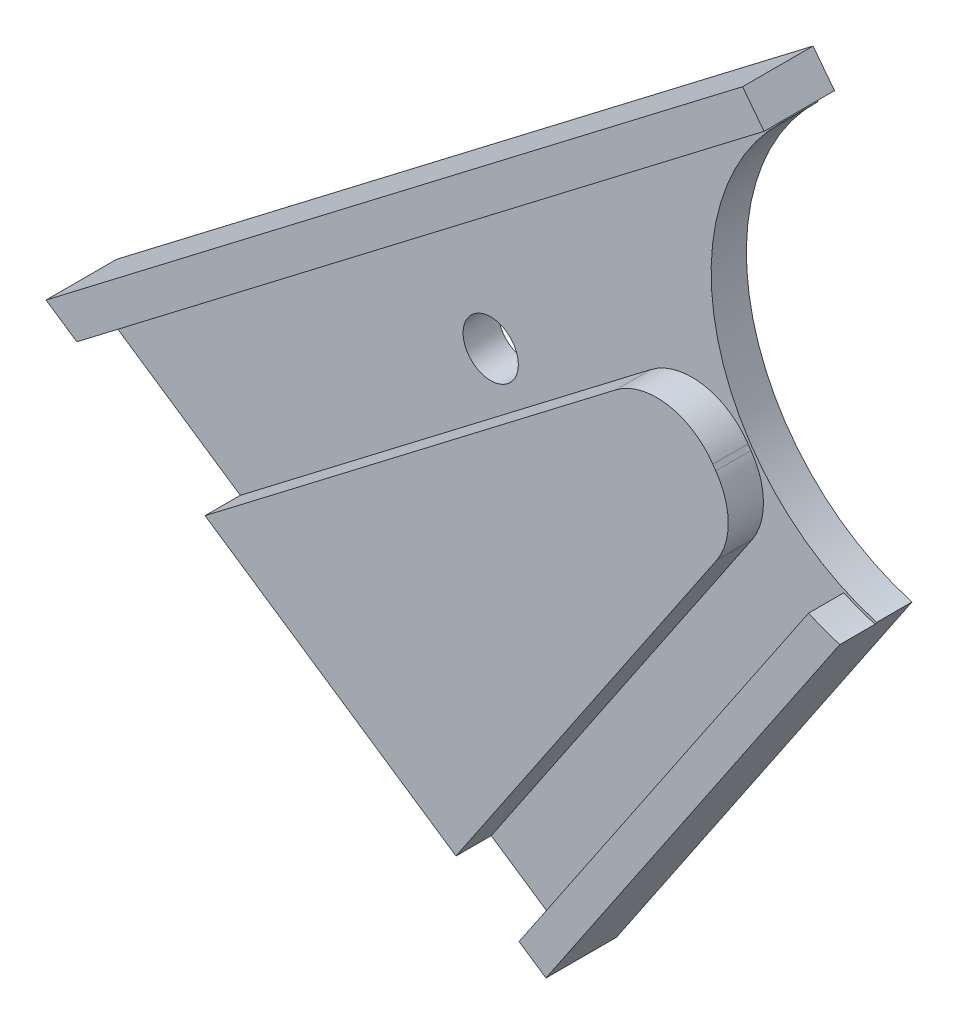
ISO-10303-21;
HEADER;
FILE_DESCRIPTION(('STEP AP214'),'2;1');
FILE_NAME('part.step','',(''),(''),'','','');
FILE_SCHEMA(('AUTOMOTIVE_DESIGN { 1 0 10303 214 1 1 1 1 }'));
ENDSEC;
DATA;
#1=APPLICATION_CONTEXT('core data for automotive mechanical design processes');
#2=APPLICATION_PROTOCOL_DEFINITION('international standard','automotive_design',2000,#1);
#3=PRODUCT_CONTEXT('',#1,'mechanical');
#4=PRODUCT('Part','Part','',(#3));
#5=PRODUCT_RELATED_PRODUCT_CATEGORY('part','',(#4));
#6=PRODUCT_DEFINITION_FORMATION('','',#4);
#7=PRODUCT_DEFINITION_CONTEXT('part definition',#1,'design');
#8=PRODUCT_DEFINITION('design','',#6,#7);
#9=PRODUCT_DEFINITION_SHAPE('','',#8);
#10=(LENGTH_UNIT() NAMED_UNIT(*) SI_UNIT(.MILLI.,.METRE.));
#11=(NAMED_UNIT(*) PLANE_ANGLE_UNIT() SI_UNIT($,.RADIAN.));
#12=(NAMED_UNIT(*) SI_UNIT($,.STERADIAN.) SOLID_ANGLE_UNIT());
#13=UNCERTAINTY_MEASURE_WITH_UNIT(LENGTH_MEASURE(1.E-05),#10,'distance_accuracy_value','');
#14=(GEOMETRIC_REPRESENTATION_CONTEXT(3) GLOBAL_UNCERTAINTY_ASSIGNED_CONTEXT((#13)) GLOBAL_UNIT_ASSIGNED_CONTEXT((#10,
#11,#12)) REPRESENTATION_CONTEXT('',''));
#15=CARTESIAN_POINT('',(0.,0.,0.));
#16=DIRECTION('',(0.,0.,1.));
#17=DIRECTION('',(1.,0.,0.));
#18=AXIS2_PLACEMENT_3D('',#15,#16,#17);
#19=CARTESIAN_POINT('',(0.,0.,3.175));
#20=DIRECTION('',(0.,0.,1.));
#21=DIRECTION('',(1.,0.,0.));
#22=AXIS2_PLACEMENT_3D('',#19,#20,#21);
#23=PLANE('',#22);
#24=CARTESIAN_POINT('',(504.511571135266,517.150066419649,3.175));
#25=DIRECTION('',(0.,0.,1.));
#26=DIRECTION('',(1.,0.,0.));
#27=AXIS2_PLACEMENT_3D('',#24,#25,#26);
#28=CIRCLE('',#27,20.8915);
#29=CARTESIAN_POINT('',(498.646303140477,497.09879704339,3.175));
#30=VERTEX_POINT('',#29);
#31=CARTESIAN_POINT('',(495.830397733204,498.147645505109,3.175));
#32=VERTEX_POINT('',#31);
#33=EDGE_CURVE('E259',#30,#32,#28,.F.);
#34=ORIENTED_EDGE('',*,*,#33,.F.);
#35=DIRECTION('',(0.559192903470747,0.829037572555041,0.));
#36=VECTOR('',#35,1.);
#37=CARTESIAN_POINT('',(112.270258668083,-75.7272456597241,3.175));
#38=LINE('',#37,#36);
#39=CARTESIAN_POINT('',(498.795485399412,497.319968837681,3.175));
#40=VERTEX_POINT('',#39);
#41=EDGE_CURVE('E391',#30,#40,#38,.T.);
#42=ORIENTED_EDGE('',*,*,#41,.T.);
#43=CARTESIAN_POINT('',(504.511571135266,517.150066419649,3.175));
#44=DIRECTION('',(0.,0.,1.));
#45=DIRECTION('',(1.,0.,0.));
#46=AXIS2_PLACEMENT_3D('',#43,#44,#45);
#47=CIRCLE('',#46,20.6375);
#48=CARTESIAN_POINT('',(490.316044259021,532.129833539194,3.175));
#49=VERTEX_POINT('',#48);
#50=EDGE_CURVE('E395',#49,#40,#47,.T.);
#51=ORIENTED_EDGE('',*,*,#50,.F.);
#52=DIRECTION('',(0.687851090308898,-0.725851828929886,0.));
#53=VECTOR('',#52,1.);
#54=CARTESIAN_POINT('',(524.009045454508,496.575442647848,3.175));
#55=LINE('',#54,#53);
#56=CARTESIAN_POINT('',(490.141330082083,532.314199903743,3.175));
#57=VERTEX_POINT('',#56);
#58=EDGE_CURVE('E399',#57,#49,#55,.T.);
#59=ORIENTED_EDGE('',*,*,#58,.F.);
#60=CARTESIAN_POINT('',(504.511571135266,517.150066419649,3.175));
#61=DIRECTION('',(0.,0.,1.));
#62=DIRECTION('',(1.,0.,0.));
#63=AXIS2_PLACEMENT_3D('',#60,#61,#62);
#64=CIRCLE('',#63,20.8915);
#65=CARTESIAN_POINT('',(491.815309265469,533.741018977702,3.175));
#66=VERTEX_POINT('',#65);
#67=EDGE_CURVE('E403',#66,#57,#64,.T.);
#68=ORIENTED_EDGE('',*,*,#67,.F.);
#69=DIRECTION('',(0.794148460285417,0.607723804886975,0.));
#70=VECTOR('',#69,1.);
#71=CARTESIAN_POINT('',(-75.954376972135,99.2540542912867,3.175));
#72=LINE('',#71,#70);
#73=CARTESIAN_POINT('',(429.889049813533,486.351816708112,3.175));
#74=VERTEX_POINT('',#73);
#75=EDGE_CURVE('E318',#74,#66,#72,.T.);
#76=ORIENTED_EDGE('',*,*,#75,.F.);
#77=DIRECTION('',(-0.829037572555041,0.559192903470747,0.));
#78=VECTOR('',#77,1.);
#79=CARTESIAN_POINT('',(359.893664703535,533.564300104471,3.175));
#80=LINE('',#79,#78);
#81=CARTESIAN_POINT('',(441.440727472043,478.560111743629,3.175));
#82=VERTEX_POINT('',#81);
#83=EDGE_CURVE('E392',#82,#74,#80,.T.);
#84=ORIENTED_EDGE('',*,*,#83,.F.);
#85=DIRECTION('',(0.794148460285417,0.607723804886974,0.));
#86=VECTOR('',#85,1.);
#87=CARTESIAN_POINT('',(-67.9275609571879,88.7649414278371,3.175));
#88=LINE('',#87,#86);
#89=CARTESIAN_POINT('',(478.447155565869,506.879359857985,3.175));
#90=VERTEX_POINT('',#89);
#91=EDGE_CURVE('E377',#82,#90,#88,.T.);
#92=ORIENTED_EDGE('',*,*,#91,.T.);
#93=CARTESIAN_POINT('',(482.15183988046,502.038230844085,3.175));
#94=DIRECTION('',(0.,0.,1.));
#95=DIRECTION('',(1.,0.,0.));
#96=AXIS2_PLACEMENT_3D('',#93,#94,#95);
#97=CIRCLE('',#96,6.09599999999997);
#98=CARTESIAN_POINT('',(487.202508587428,505.451727821154,3.175));
#99=VERTEX_POINT('',#98);
#100=EDGE_CURVE('E380',#99,#90,#97,.T.);
#101=ORIENTED_EDGE('',*,*,#100,.F.);
#102=CARTESIAN_POINT('',(504.511571135266,517.150066419649,3.175));
#103=DIRECTION('',(0.,0.,1.));
#104=DIRECTION('',(1.,0.,0.));
#105=AXIS2_PLACEMENT_3D('',#102,#103,#104);
#106=CIRCLE('',#105,20.8915);
#107=CARTESIAN_POINT('',(487.468121912979,505.068029718109,3.175));
#108=VERTEX_POINT('',#107);
#109=EDGE_CURVE('E384',#108,#99,#106,.F.);
#110=ORIENTED_EDGE('',*,*,#109,.F.);
#111=CARTESIAN_POINT('',(482.49495739827,501.542572200335,3.175));
#112=DIRECTION('',(0.,0.,1.));
#113=DIRECTION('',(1.,0.,0.));
#114=AXIS2_PLACEMENT_3D('',#111,#112,#113);
#115=CIRCLE('',#114,6.09600000000011);
#116=CARTESIAN_POINT('',(487.548770440565,498.133732260777,3.175));
#117=VERTEX_POINT('',#116);
#118=EDGE_CURVE('E369',#117,#108,#115,.T.);
#119=ORIENTED_EDGE('',*,*,#118,.F.);
#120=DIRECTION('',(0.559192903470747,0.829037572555042,0.));
#121=VECTOR('',#120,1.);
#122=CARTESIAN_POINT('',(104.163100246067,-70.2588982566839,3.175));
#123=LINE('',#122,#121);
#124=CARTESIAN_POINT('',(464.056764949602,463.305401847788,3.175));
#125=VERTEX_POINT('',#124);
#126=EDGE_CURVE('E373',#125,#117,#123,.T.);
#127=ORIENTED_EDGE('',*,*,#126,.F.);
#128=CARTESIAN_POINT('',(469.742304622184,459.470456915785,3.175));
#129=VERTEX_POINT('',#128);
#130=EDGE_CURVE('E152',#129,#125,#80,.T.);
#131=ORIENTED_EDGE('',*,*,#130,.F.);
#132=DIRECTION('',(0.559192903470747,0.829037572555042,0.));
#133=VECTOR('',#132,1.);
#134=CARTESIAN_POINT('',(109.84863991865,-74.0938431886862,3.175));
#135=LINE('',#134,#133);
#136=EDGE_CURVE('E147',#129,#32,#135,.T.);
#137=ORIENTED_EDGE('',*,*,#136,.T.);
#138=EDGE_LOOP('',(#34,#42,#51,#59,#68,#76,#84,#92,#101,#110,#119,#127,#131,#137));
#139=FACE_BOUND('',#138,.T.);
#140=CARTESIAN_POINT('',(464.009536590087,501.284203587237,3.175));
#141=DIRECTION('',(0.,0.,1.));
#142=DIRECTION('',(1.,0.,0.));
#143=AXIS2_PLACEMENT_3D('',#140,#141,#142);
#144=CIRCLE('',#143,2.48919999999983);
#145=CARTESIAN_POINT('',(466.498736590087,501.284203587237,3.175));
#146=VERTEX_POINT('',#145);
#147=EDGE_CURVE('E407',#146,#146,#144,.T.);
#148=ORIENTED_EDGE('',*,*,#147,.F.);
#149=EDGE_LOOP('',(#148));
#150=FACE_BOUND('',#149,.T.);
#151=ADVANCED_FACE('F131',(#139,#150),#23,.T.);
#152=CARTESIAN_POINT('',(-77.8839000526511,101.775475652693,3.175));
#153=DIRECTION('',(0.607723804886975,-0.794148460285417,0.));
#154=DIRECTION('',(0.794148460285417,0.607723804886975,0.));
#155=AXIS2_PLACEMENT_3D('',#152,#153,#154);
#156=PLANE('',#155);
#157=DIRECTION('',(-0.794148460285417,-0.607723804886975,0.));
#158=VECTOR('',#157,1.);
#159=CARTESIAN_POINT('',(-77.8839000526511,101.775475652693,0.));
#160=LINE('',#159,#158);
#161=CARTESIAN_POINT('',(489.885786184953,536.262440339108,0.));
#162=VERTEX_POINT('',#161);
#163=CARTESIAN_POINT('',(427.112204222545,488.22482270919,0.));
#164=VERTEX_POINT('',#163);
#165=EDGE_CURVE('E388',#162,#164,#160,.T.);
#166=ORIENTED_EDGE('',*,*,#165,.T.);
#167=DIRECTION('',(0.,0.,-1.));
#168=VECTOR('',#167,1.);
#169=CARTESIAN_POINT('',(427.112204222545,488.22482270919,3.175));
#170=LINE('',#169,#168);
#171=CARTESIAN_POINT('',(427.112204222545,488.22482270919,6.35));
#172=VERTEX_POINT('',#171);
#173=EDGE_CURVE('E12',#172,#164,#170,.T.);
#174=ORIENTED_EDGE('',*,*,#173,.F.);
#175=DIRECTION('',(-0.794148460285417,-0.607723804886975,0.));
#176=VECTOR('',#175,1.);
#177=CARTESIAN_POINT('',(-77.8839000526511,101.775475652693,6.35));
#178=LINE('',#177,#176);
#179=CARTESIAN_POINT('',(489.885786184953,536.262440339108,6.35));
#180=VERTEX_POINT('',#179);
#181=EDGE_CURVE('E298',#180,#172,#178,.T.);
#182=ORIENTED_EDGE('',*,*,#181,.F.);
#183=DIRECTION('',(0.,0.,-1.));
#184=VECTOR('',#183,1.);
#185=CARTESIAN_POINT('',(489.885786184953,536.262440339108,3.175));
#186=LINE('',#185,#184);
#187=EDGE_CURVE('E411',#180,#162,#186,.T.);
#188=ORIENTED_EDGE('',*,*,#187,.T.);
#189=EDGE_LOOP('',(#166,#174,#182,#188));
#190=FACE_BOUND('',#189,.T.);
#191=ADVANCED_FACE('F133',(#190),#156,.F.);
#192=CARTESIAN_POINT('',(359.893664703535,533.564300104471,3.175));
#193=DIRECTION('',(-0.559192903470747,-0.829037572555041,0.));
#194=DIRECTION('',(0.829037572555041,-0.559192903470747,0.));
#195=AXIS2_PLACEMENT_3D('',#192,#193,#194);
#196=PLANE('',#195);
#197=DIRECTION('',(0.,0.,-1.));
#198=VECTOR('',#197,1.);
#199=CARTESIAN_POINT('',(472.163923371617,457.837054444747,3.175));
#200=LINE('',#199,#198);
#201=CARTESIAN_POINT('',(472.163923371617,457.837054444747,6.35));
#202=VERTEX_POINT('',#201);
#203=CARTESIAN_POINT('',(472.163923371617,457.837054444747,0.));
#204=VERTEX_POINT('',#203);
#205=EDGE_CURVE('E140',#202,#204,#200,.T.);
#206=ORIENTED_EDGE('',*,*,#205,.F.);
#207=DIRECTION('',(-0.829037572555041,0.559192903470747,0.));
#208=VECTOR('',#207,1.);
#209=CARTESIAN_POINT('',(359.893664703535,533.564300104471,6.35));
#210=LINE('',#209,#208);
#211=CARTESIAN_POINT('',(469.742304622184,459.470456915785,6.35));
#212=VERTEX_POINT('',#211);
#213=EDGE_CURVE('E272',#202,#212,#210,.T.);
#214=ORIENTED_EDGE('',*,*,#213,.T.);
#215=DIRECTION('',(0.,0.,-1.));
#216=VECTOR('',#215,1.);
#217=CARTESIAN_POINT('',(469.742304622184,459.470456915785,6.35));
#218=LINE('',#217,#216);
#219=EDGE_CURVE('E262',#212,#129,#218,.T.);
#220=ORIENTED_EDGE('',*,*,#219,.T.);
#221=ORIENTED_EDGE('',*,*,#130,.T.);
#222=DIRECTION('',(0.,0.,-1.));
#223=VECTOR('',#222,1.);
#224=CARTESIAN_POINT('',(464.056764949602,463.305401847788,6.35));
#225=LINE('',#224,#223);
#226=CARTESIAN_POINT('',(464.056764949602,463.305401847788,6.35));
#227=VERTEX_POINT('',#226);
#228=EDGE_CURVE('E353',#227,#125,#225,.T.);
#229=ORIENTED_EDGE('',*,*,#228,.F.);
#230=DIRECTION('',(-0.829037572555041,0.559192903470747,0.));
#231=VECTOR('',#230,1.);
#232=CARTESIAN_POINT('',(359.893664703535,533.564300104471,6.35));
#233=LINE('',#232,#231);
#234=CARTESIAN_POINT('',(441.440727472043,478.560111743629,6.35));
#235=VERTEX_POINT('',#234);
#236=EDGE_CURVE('E333',#227,#235,#233,.T.);
#237=ORIENTED_EDGE('',*,*,#236,.T.);
#238=DIRECTION('',(0.,0.,-1.));
#239=VECTOR('',#238,1.);
#240=CARTESIAN_POINT('',(441.440727472043,478.560111743629,6.35));
#241=LINE('',#240,#239);
#242=EDGE_CURVE('E357',#235,#82,#241,.T.);
#243=ORIENTED_EDGE('',*,*,#242,.T.);
#244=ORIENTED_EDGE('',*,*,#83,.T.);
#245=DIRECTION('',(0.,0.,-1.));
#246=VECTOR('',#245,1.);
#247=CARTESIAN_POINT('',(429.889049813533,486.351816708112,6.35));
#248=LINE('',#247,#246);
#249=CARTESIAN_POINT('',(429.889049813533,486.351816708112,6.35));
#250=VERTEX_POINT('',#249);
#251=EDGE_CURVE('E314',#250,#74,#248,.T.);
#252=ORIENTED_EDGE('',*,*,#251,.F.);
#253=DIRECTION('',(-0.829037572555041,0.559192903470747,0.));
#254=VECTOR('',#253,1.);
#255=CARTESIAN_POINT('',(359.893664703535,533.564300104471,6.35));
#256=LINE('',#255,#254);
#257=EDGE_CURVE('E302',#250,#172,#256,.T.);
#258=ORIENTED_EDGE('',*,*,#257,.T.);
#259=ORIENTED_EDGE('',*,*,#173,.T.);
#260=DIRECTION('',(-0.829037572555041,0.559192903470747,0.));
#261=VECTOR('',#260,1.);
#262=CARTESIAN_POINT('',(359.893664703535,533.564300104471,0.));
#263=LINE('',#262,#261);
#264=EDGE_CURVE('E415',#204,#164,#263,.T.);
#265=ORIENTED_EDGE('',*,*,#264,.F.);
#266=EDGE_LOOP('',(#206,#214,#220,#221,#229,#237,#243,#244,#252,#258,#259,#265));
#267=FACE_BOUND('',#266,.T.);
#268=ADVANCED_FACE('F467',(#267),#196,.T.);
#269=CARTESIAN_POINT('',(112.270258668083,-75.7272456597241,3.175));
#270=DIRECTION('',(-0.829037572555041,0.559192903470747,0.));
#271=DIRECTION('',(-0.559192903470747,-0.829037572555041,0.));
#272=AXIS2_PLACEMENT_3D('',#269,#270,#271);
#273=PLANE('',#272);
#274=ORIENTED_EDGE('',*,*,#41,.F.);
#275=DIRECTION('',(0.,0.,-1.));
#276=VECTOR('',#275,1.);
#277=CARTESIAN_POINT('',(498.646303140477,497.09879704339,6.35));
#278=LINE('',#277,#276);
#279=CARTESIAN_POINT('',(498.646303140477,497.09879704339,6.35));
#280=VERTEX_POINT('',#279);
#281=EDGE_CURVE('E285',#280,#30,#278,.T.);
#282=ORIENTED_EDGE('',*,*,#281,.F.);
#283=DIRECTION('',(0.559192903470747,0.829037572555041,0.));
#284=VECTOR('',#283,1.);
#285=CARTESIAN_POINT('',(112.270258668083,-75.7272456597241,6.35));
#286=LINE('',#285,#284);
#287=EDGE_CURVE('E276',#202,#280,#286,.T.);
#288=ORIENTED_EDGE('',*,*,#287,.F.);
#289=ORIENTED_EDGE('',*,*,#205,.T.);
#290=DIRECTION('',(0.559192903470747,0.829037572555041,0.));
#291=VECTOR('',#290,1.);
#292=CARTESIAN_POINT('',(112.270258668083,-75.7272456597241,0.));
#293=LINE('',#292,#291);
#294=CARTESIAN_POINT('',(498.795485399412,497.319968837681,0.));
#295=VERTEX_POINT('',#294);
#296=EDGE_CURVE('E418',#204,#295,#293,.T.);
#297=ORIENTED_EDGE('',*,*,#296,.T.);
#298=DIRECTION('',(0.,0.,-1.));
#299=VECTOR('',#298,1.);
#300=CARTESIAN_POINT('',(498.795485399412,497.319968837681,3.175));
#301=LINE('',#300,#299);
#302=EDGE_CURVE('E452',#40,#295,#301,.T.);
#303=ORIENTED_EDGE('',*,*,#302,.F.);
#304=EDGE_LOOP('',(#274,#282,#288,#289,#297,#303));
#305=FACE_BOUND('',#304,.T.);
#306=ADVANCED_FACE('F458',(#305),#273,.F.);
#307=CARTESIAN_POINT('',(504.511571135266,517.150066419649,3.175));
#308=DIRECTION('',(0.,0.,-1.));
#309=DIRECTION('',(-1.,0.,0.));
#310=AXIS2_PLACEMENT_3D('',#307,#308,#309);
#311=CYLINDRICAL_SURFACE('',#310,20.6375);
#312=CARTESIAN_POINT('',(504.511571135266,517.150066419649,0.));
#313=DIRECTION('',(0.,0.,1.));
#314=DIRECTION('',(1.,0.,0.));
#315=AXIS2_PLACEMENT_3D('',#312,#313,#314);
#316=CIRCLE('',#315,20.6375);
#317=CARTESIAN_POINT('',(490.316044259021,532.129833539194,0.));
#318=VERTEX_POINT('',#317);
#319=EDGE_CURVE('E421',#318,#295,#316,.T.);
#320=ORIENTED_EDGE('',*,*,#319,.F.);
#321=DIRECTION('',(0.,0.,-1.));
#322=VECTOR('',#321,1.);
#323=CARTESIAN_POINT('',(490.316044259021,532.129833539194,3.175));
#324=LINE('',#323,#322);
#325=EDGE_CURVE('E449',#49,#318,#324,.T.);
#326=ORIENTED_EDGE('',*,*,#325,.F.);
#327=ORIENTED_EDGE('',*,*,#50,.T.);
#328=ORIENTED_EDGE('',*,*,#302,.T.);
#329=EDGE_LOOP('',(#320,#326,#327,#328));
#330=FACE_BOUND('',#329,.T.);
#331=ADVANCED_FACE('F484',(#330),#311,.F.);
#332=CARTESIAN_POINT('',(524.009045454508,496.575442647848,3.175));
#333=DIRECTION('',(0.725851828929886,0.687851090308898,0.));
#334=DIRECTION('',(-0.687851090308898,0.725851828929886,0.));
#335=AXIS2_PLACEMENT_3D('',#332,#333,#334);
#336=PLANE('',#335);
#337=DIRECTION('',(0.687851090308898,-0.725851828929886,0.));
#338=VECTOR('',#337,1.);
#339=CARTESIAN_POINT('',(524.009045454508,496.575442647848,0.));
#340=LINE('',#339,#338);
#341=CARTESIAN_POINT('',(490.141330082083,532.314199903743,0.));
#342=VERTEX_POINT('',#341);
#343=EDGE_CURVE('E425',#342,#318,#340,.T.);
#344=ORIENTED_EDGE('',*,*,#343,.F.);
#345=DIRECTION('',(0.,0.,-1.));
#346=VECTOR('',#345,1.);
#347=CARTESIAN_POINT('',(490.141330082083,532.314199903743,3.175));
#348=LINE('',#347,#346);
#349=EDGE_CURVE('E446',#57,#342,#348,.T.);
#350=ORIENTED_EDGE('',*,*,#349,.F.);
#351=ORIENTED_EDGE('',*,*,#58,.T.);
#352=ORIENTED_EDGE('',*,*,#325,.T.);
#353=EDGE_LOOP('',(#344,#350,#351,#352));
#354=FACE_BOUND('',#353,.T.);
#355=ADVANCED_FACE('F480',(#354),#336,.T.);
#356=CARTESIAN_POINT('',(504.511571135266,517.150066419649,3.175));
#357=DIRECTION('',(0.,0.,-1.));
#358=DIRECTION('',(-1.,0.,0.));
#359=AXIS2_PLACEMENT_3D('',#356,#357,#358);
#360=CYLINDRICAL_SURFACE('',#359,20.8915);
#361=CARTESIAN_POINT('',(504.511571135266,517.150066419649,0.));
#362=DIRECTION('',(0.,0.,1.));
#363=DIRECTION('',(1.,0.,0.));
#364=AXIS2_PLACEMENT_3D('',#361,#362,#363);
#365=CIRCLE('',#364,20.8915);
#366=CARTESIAN_POINT('',(491.815309265469,533.741018977702,0.));
#367=VERTEX_POINT('',#366);
#368=EDGE_CURVE('E429',#367,#342,#365,.T.);
#369=ORIENTED_EDGE('',*,*,#368,.F.);
#370=DIRECTION('',(0.,0.,-1.));
#371=VECTOR('',#370,1.);
#372=CARTESIAN_POINT('',(491.815309265469,533.741018977702,3.175));
#373=LINE('',#372,#371);
#374=EDGE_CURVE('E443',#66,#367,#373,.T.);
#375=ORIENTED_EDGE('',*,*,#374,.F.);
#376=ORIENTED_EDGE('',*,*,#67,.T.);
#377=ORIENTED_EDGE('',*,*,#349,.T.);
#378=EDGE_LOOP('',(#369,#375,#376,#377));
#379=FACE_BOUND('',#378,.T.);
#380=ADVANCED_FACE('F477',(#379),#360,.F.);
#381=CARTESIAN_POINT('',(567.769686237607,434.48696468641,3.175));
#382=DIRECTION('',(0.794148460285422,0.607723804886968,0.));
#383=DIRECTION('',(-0.607723804886968,0.794148460285422,0.));
#384=AXIS2_PLACEMENT_3D('',#381,#382,#383);
#385=PLANE('',#384);
#386=DIRECTION('',(0.607723804886968,-0.794148460285422,0.));
#387=VECTOR('',#386,1.);
#388=CARTESIAN_POINT('',(567.769686237607,434.48696468641,0.));
#389=LINE('',#388,#387);
#390=EDGE_CURVE('E433',#162,#367,#389,.T.);
#391=ORIENTED_EDGE('',*,*,#390,.F.);
#392=ORIENTED_EDGE('',*,*,#187,.F.);
#393=DIRECTION('',(0.607723804886968,-0.794148460285422,0.));
#394=VECTOR('',#393,1.);
#395=CARTESIAN_POINT('',(567.769686237607,434.48696468641,6.35));
#396=LINE('',#395,#394);
#397=CARTESIAN_POINT('',(491.815309265469,533.741018977702,6.35));
#398=VERTEX_POINT('',#397);
#399=EDGE_CURVE('E294',#180,#398,#396,.T.);
#400=ORIENTED_EDGE('',*,*,#399,.T.);
#401=DIRECTION('',(0.,0.,-1.));
#402=VECTOR('',#401,1.);
#403=CARTESIAN_POINT('',(491.815309265469,533.741018977702,6.35));
#404=LINE('',#403,#402);
#405=EDGE_CURVE('E310',#398,#66,#404,.T.);
#406=ORIENTED_EDGE('',*,*,#405,.T.);
#407=ORIENTED_EDGE('',*,*,#374,.T.);
#408=EDGE_LOOP('',(#391,#392,#400,#406,#407));
#409=FACE_BOUND('',#408,.T.);
#410=ADVANCED_FACE('F473',(#409),#385,.T.);
#411=CARTESIAN_POINT('',(464.009536590087,501.284203587237,3.175));
#412=DIRECTION('',(0.,0.,-1.));
#413=DIRECTION('',(-1.,0.,0.));
#414=AXIS2_PLACEMENT_3D('',#411,#412,#413);
#415=CYLINDRICAL_SURFACE('',#414,2.48919999999983);
#416=ORIENTED_EDGE('',*,*,#147,.T.);
#417=EDGE_LOOP('',(#416));
#418=FACE_BOUND('',#417,.T.);
#419=CARTESIAN_POINT('',(464.009536590087,501.284203587237,0.));
#420=DIRECTION('',(0.,0.,1.));
#421=DIRECTION('',(1.,0.,0.));
#422=AXIS2_PLACEMENT_3D('',#419,#420,#421);
#423=CIRCLE('',#422,2.48919999999983);
#424=CARTESIAN_POINT('',(466.498736590087,501.284203587237,0.));
#425=VERTEX_POINT('',#424);
#426=EDGE_CURVE('E437',#425,#425,#423,.T.);
#427=ORIENTED_EDGE('',*,*,#426,.F.);
#428=EDGE_LOOP('',(#427));
#429=FACE_BOUND('',#428,.T.);
#430=ADVANCED_FACE('F490',(#418,#429),#415,.F.);
#431=CARTESIAN_POINT('',(0.,0.,0.));
#432=DIRECTION('',(0.,0.,1.));
#433=DIRECTION('',(1.,0.,0.));
#434=AXIS2_PLACEMENT_3D('',#431,#432,#433);
#435=PLANE('',#434);
#436=ORIENTED_EDGE('',*,*,#319,.T.);
#437=ORIENTED_EDGE('',*,*,#296,.F.);
#438=ORIENTED_EDGE('',*,*,#264,.T.);
#439=ORIENTED_EDGE('',*,*,#165,.F.);
#440=ORIENTED_EDGE('',*,*,#390,.T.);
#441=ORIENTED_EDGE('',*,*,#368,.T.);
#442=ORIENTED_EDGE('',*,*,#343,.T.);
#443=EDGE_LOOP('',(#436,#437,#438,#439,#440,#441,#442));
#444=FACE_BOUND('',#443,.T.);
#445=ORIENTED_EDGE('',*,*,#426,.T.);
#446=EDGE_LOOP('',(#445));
#447=FACE_BOUND('',#446,.T.);
#448=ADVANCED_FACE('F463',(#444,#447),#435,.F.);
#449=CARTESIAN_POINT('',(504.511571135266,517.150066419649,6.35));
#450=DIRECTION('',(0.,0.,-1.));
#451=DIRECTION('',(-1.,0.,0.));
#452=AXIS2_PLACEMENT_3D('',#449,#450,#451);
#453=CYLINDRICAL_SURFACE('',#452,20.8915);
#454=DIRECTION('',(0.,0.,-1.));
#455=VECTOR('',#454,1.);
#456=CARTESIAN_POINT('',(487.468121912979,505.068029718109,6.35));
#457=LINE('',#456,#455);
#458=CARTESIAN_POINT('',(487.468121912979,505.068029718109,6.35));
#459=VERTEX_POINT('',#458);
#460=EDGE_CURVE('E345',#459,#108,#457,.T.);
#461=ORIENTED_EDGE('',*,*,#460,.T.);
#462=ORIENTED_EDGE('',*,*,#109,.T.);
#463=DIRECTION('',(0.,0.,-1.));
#464=VECTOR('',#463,1.);
#465=CARTESIAN_POINT('',(487.202508587428,505.451727821154,6.35));
#466=LINE('',#465,#464);
#467=CARTESIAN_POINT('',(487.202508587428,505.451727821154,6.35));
#468=VERTEX_POINT('',#467);
#469=EDGE_CURVE('E365',#468,#99,#466,.T.);
#470=ORIENTED_EDGE('',*,*,#469,.F.);
#471=CARTESIAN_POINT('',(504.511571135266,517.150066419649,6.35));
#472=DIRECTION('',(0.,0.,1.));
#473=DIRECTION('',(1.,0.,0.));
#474=AXIS2_PLACEMENT_3D('',#471,#472,#473);
#475=CIRCLE('',#474,20.8915);
#476=EDGE_CURVE('E322',#468,#459,#475,.T.);
#477=ORIENTED_EDGE('',*,*,#476,.T.);
#478=EDGE_LOOP('',(#461,#462,#470,#477));
#479=FACE_BOUND('',#478,.T.);
#480=ADVANCED_FACE('F496',(#479),#453,.F.);
#481=CARTESIAN_POINT('',(482.15183988046,502.038230844085,6.35));
#482=DIRECTION('',(0.,0.,-1.));
#483=DIRECTION('',(-1.,0.,0.));
#484=AXIS2_PLACEMENT_3D('',#481,#482,#483);
#485=CYLINDRICAL_SURFACE('',#484,6.09599999999997);
#486=ORIENTED_EDGE('',*,*,#469,.T.);
#487=ORIENTED_EDGE('',*,*,#100,.T.);
#488=DIRECTION('',(0.,0.,-1.));
#489=VECTOR('',#488,1.);
#490=CARTESIAN_POINT('',(478.447155565869,506.879359857985,6.35));
#491=LINE('',#490,#489);
#492=CARTESIAN_POINT('',(478.447155565869,506.879359857985,6.35));
#493=VERTEX_POINT('',#492);
#494=EDGE_CURVE('E361',#493,#90,#491,.T.);
#495=ORIENTED_EDGE('',*,*,#494,.F.);
#496=CARTESIAN_POINT('',(482.15183988046,502.038230844085,6.35));
#497=DIRECTION('',(0.,0.,1.));
#498=DIRECTION('',(1.,0.,0.));
#499=AXIS2_PLACEMENT_3D('',#496,#497,#498);
#500=CIRCLE('',#499,6.09599999999997);
#501=EDGE_CURVE('E326',#493,#468,#500,.F.);
#502=ORIENTED_EDGE('',*,*,#501,.T.);
#503=EDGE_LOOP('',(#486,#487,#495,#502));
#504=FACE_BOUND('',#503,.T.);
#505=ADVANCED_FACE('F502',(#504),#485,.T.);
#506=CARTESIAN_POINT('',(-67.9275609571879,88.7649414278371,6.35));
#507=DIRECTION('',(0.607723804886974,-0.794148460285417,0.));
#508=DIRECTION('',(0.794148460285417,0.607723804886974,0.));
#509=AXIS2_PLACEMENT_3D('',#506,#507,#508);
#510=PLANE('',#509);
#511=ORIENTED_EDGE('',*,*,#91,.F.);
#512=ORIENTED_EDGE('',*,*,#242,.F.);
#513=DIRECTION('',(-0.794148460285417,-0.607723804886975,0.));
#514=VECTOR('',#513,1.);
#515=CARTESIAN_POINT('',(-67.9275609571879,88.7649414278371,6.35));
#516=LINE('',#515,#514);
#517=EDGE_CURVE('E330',#493,#235,#516,.T.);
#518=ORIENTED_EDGE('',*,*,#517,.F.);
#519=ORIENTED_EDGE('',*,*,#494,.T.);
#520=EDGE_LOOP('',(#511,#512,#518,#519));
#521=FACE_BOUND('',#520,.T.);
#522=ADVANCED_FACE('F596',(#521),#510,.F.);
#523=CARTESIAN_POINT('',(104.163100246067,-70.2588982566839,6.35));
#524=DIRECTION('',(0.829037572555042,-0.559192903470747,0.));
#525=DIRECTION('',(0.559192903470747,0.829037572555042,0.));
#526=AXIS2_PLACEMENT_3D('',#523,#524,#525);
#527=PLANE('',#526);
#528=ORIENTED_EDGE('',*,*,#228,.T.);
#529=ORIENTED_EDGE('',*,*,#126,.T.);
#530=DIRECTION('',(0.,0.,-1.));
#531=VECTOR('',#530,1.);
#532=CARTESIAN_POINT('',(487.548770440565,498.133732260777,6.35));
#533=LINE('',#532,#531);
#534=CARTESIAN_POINT('',(487.548770440565,498.133732260777,6.35));
#535=VERTEX_POINT('',#534);
#536=EDGE_CURVE('E349',#535,#117,#533,.T.);
#537=ORIENTED_EDGE('',*,*,#536,.F.);
#538=DIRECTION('',(-0.559192903470747,-0.829037572555042,0.));
#539=VECTOR('',#538,1.);
#540=CARTESIAN_POINT('',(104.163100246067,-70.2588982566839,6.35));
#541=LINE('',#540,#539);
#542=EDGE_CURVE('E337',#535,#227,#541,.T.);
#543=ORIENTED_EDGE('',*,*,#542,.T.);
#544=EDGE_LOOP('',(#528,#529,#537,#543));
#545=FACE_BOUND('',#544,.T.);
#546=ADVANCED_FACE('F606',(#545),#527,.T.);
#547=CARTESIAN_POINT('',(482.49495739827,501.542572200335,6.35));
#548=DIRECTION('',(0.,0.,-1.));
#549=DIRECTION('',(-1.,0.,0.));
#550=AXIS2_PLACEMENT_3D('',#547,#548,#549);
#551=CYLINDRICAL_SURFACE('',#550,6.09600000000011);
#552=ORIENTED_EDGE('',*,*,#536,.T.);
#553=ORIENTED_EDGE('',*,*,#118,.T.);
#554=ORIENTED_EDGE('',*,*,#460,.F.);
#555=CARTESIAN_POINT('',(482.49495739827,501.542572200335,6.35));
#556=DIRECTION('',(0.,0.,1.));
#557=DIRECTION('',(1.,0.,0.));
#558=AXIS2_PLACEMENT_3D('',#555,#556,#557);
#559=CIRCLE('',#558,6.09600000000011);
#560=EDGE_CURVE('E341',#459,#535,#559,.F.);
#561=ORIENTED_EDGE('',*,*,#560,.T.);
#562=EDGE_LOOP('',(#552,#553,#554,#561));
#563=FACE_BOUND('',#562,.T.);
#564=ADVANCED_FACE('F616',(#563),#551,.T.);
#565=CARTESIAN_POINT('',(0.,0.,6.35));
#566=DIRECTION('',(0.,0.,1.));
#567=DIRECTION('',(1.,0.,0.));
#568=AXIS2_PLACEMENT_3D('',#565,#566,#567);
#569=PLANE('',#568);
#570=ORIENTED_EDGE('',*,*,#476,.F.);
#571=ORIENTED_EDGE('',*,*,#501,.F.);
#572=ORIENTED_EDGE('',*,*,#517,.T.);
#573=ORIENTED_EDGE('',*,*,#236,.F.);
#574=ORIENTED_EDGE('',*,*,#542,.F.);
#575=ORIENTED_EDGE('',*,*,#560,.F.);
#576=EDGE_LOOP('',(#570,#571,#572,#573,#574,#575));
#577=FACE_BOUND('',#576,.T.);
#578=ADVANCED_FACE('F626',(#577),#569,.T.);
#579=CARTESIAN_POINT('',(-75.954376972135,99.2540542912868,6.35));
#580=DIRECTION('',(0.607723804886975,-0.794148460285417,0.));
#581=DIRECTION('',(0.794148460285417,0.607723804886975,0.));
#582=AXIS2_PLACEMENT_3D('',#579,#580,#581);
#583=PLANE('',#582);
#584=ORIENTED_EDGE('',*,*,#251,.T.);
#585=ORIENTED_EDGE('',*,*,#75,.T.);
#586=ORIENTED_EDGE('',*,*,#405,.F.);
#587=DIRECTION('',(-0.794148460285417,-0.607723804886975,0.));
#588=VECTOR('',#587,1.);
#589=CARTESIAN_POINT('',(-75.954376972135,99.2540542912868,6.35));
#590=LINE('',#589,#588);
#591=EDGE_CURVE('E306',#398,#250,#590,.T.);
#592=ORIENTED_EDGE('',*,*,#591,.T.);
#593=EDGE_LOOP('',(#584,#585,#586,#592));
#594=FACE_BOUND('',#593,.T.);
#595=ADVANCED_FACE('F636',(#594),#583,.T.);
#596=CARTESIAN_POINT('',(0.,0.,6.35));
#597=DIRECTION('',(0.,0.,1.));
#598=DIRECTION('',(1.,0.,0.));
#599=AXIS2_PLACEMENT_3D('',#596,#597,#598);
#600=PLANE('',#599);
#601=ORIENTED_EDGE('',*,*,#399,.F.);
#602=ORIENTED_EDGE('',*,*,#181,.T.);
#603=ORIENTED_EDGE('',*,*,#257,.F.);
#604=ORIENTED_EDGE('',*,*,#591,.F.);
#605=EDGE_LOOP('',(#601,#602,#603,#604));
#606=FACE_BOUND('',#605,.T.);
#607=ADVANCED_FACE('F646',(#606),#600,.T.);
#608=CARTESIAN_POINT('',(504.511571135266,517.150066419649,6.35));
#609=DIRECTION('',(0.,0.,-1.));
#610=DIRECTION('',(-1.,0.,0.));
#611=AXIS2_PLACEMENT_3D('',#608,#609,#610);
#612=CYLINDRICAL_SURFACE('',#611,20.8915);
#613=ORIENTED_EDGE('',*,*,#281,.T.);
#614=ORIENTED_EDGE('',*,*,#33,.T.);
#615=DIRECTION('',(0.,0.,-1.));
#616=VECTOR('',#615,1.);
#617=CARTESIAN_POINT('',(495.830397733204,498.147645505109,6.35));
#618=LINE('',#617,#616);
#619=CARTESIAN_POINT('',(495.830397733204,498.147645505109,6.35));
#620=VERTEX_POINT('',#619);
#621=EDGE_CURVE('E253',#620,#32,#618,.T.);
#622=ORIENTED_EDGE('',*,*,#621,.F.);
#623=CARTESIAN_POINT('',(504.511571135266,517.150066419649,6.35));
#624=DIRECTION('',(0.,0.,1.));
#625=DIRECTION('',(1.,0.,0.));
#626=AXIS2_PLACEMENT_3D('',#623,#624,#625);
#627=CIRCLE('',#626,20.8915);
#628=EDGE_CURVE('E258',#620,#280,#627,.T.);
#629=ORIENTED_EDGE('',*,*,#628,.T.);
#630=EDGE_LOOP('',(#613,#614,#622,#629));
#631=FACE_BOUND('',#630,.T.);
#632=ADVANCED_FACE('F256',(#631),#612,.F.);
#633=CARTESIAN_POINT('',(109.84863991865,-74.0938431886862,6.35));
#634=DIRECTION('',(0.829037572555042,-0.559192903470747,0.));
#635=DIRECTION('',(0.559192903470747,0.829037572555042,0.));
#636=AXIS2_PLACEMENT_3D('',#633,#634,#635);
#637=PLANE('',#636);
#638=ORIENTED_EDGE('',*,*,#136,.F.);
#639=ORIENTED_EDGE('',*,*,#219,.F.);
#640=DIRECTION('',(-0.559192903470747,-0.829037572555042,0.));
#641=VECTOR('',#640,1.);
#642=CARTESIAN_POINT('',(109.84863991865,-74.0938431886862,6.35));
#643=LINE('',#642,#641);
#644=EDGE_CURVE('E265',#620,#212,#643,.T.);
#645=ORIENTED_EDGE('',*,*,#644,.F.);
#646=ORIENTED_EDGE('',*,*,#621,.T.);
#647=EDGE_LOOP('',(#638,#639,#645,#646));
#648=FACE_BOUND('',#647,.T.);
#649=ADVANCED_FACE('F266',(#648),#637,.F.);
#650=CARTESIAN_POINT('',(0.,0.,6.35));
#651=DIRECTION('',(0.,0.,1.));
#652=DIRECTION('',(1.,0.,0.));
#653=AXIS2_PLACEMENT_3D('',#650,#651,#652);
#654=PLANE('',#653);
#655=ORIENTED_EDGE('',*,*,#628,.F.);
#656=ORIENTED_EDGE('',*,*,#644,.T.);
#657=ORIENTED_EDGE('',*,*,#213,.F.);
#658=ORIENTED_EDGE('',*,*,#287,.T.);
#659=EDGE_LOOP('',(#655,#656,#657,#658));
#660=FACE_BOUND('',#659,.T.);
#661=ADVANCED_FACE('F274',(#660),#654,.T.);
#662=CLOSED_SHELL('',(#151,#191,#268,#306,#331,#355,#380,#410,#430,#448,#480,#505,#522,#546,
#564,#578,#595,#607,#632,#649,#661));
#663=MANIFOLD_SOLID_BREP('B2',#662);
#664=ADVANCED_BREP_SHAPE_REPRESENTATION('',(#18,#663),#14);
#665=SHAPE_DEFINITION_REPRESENTATION(#9,#664);
ENDSEC;
END-ISO-10303-21;
